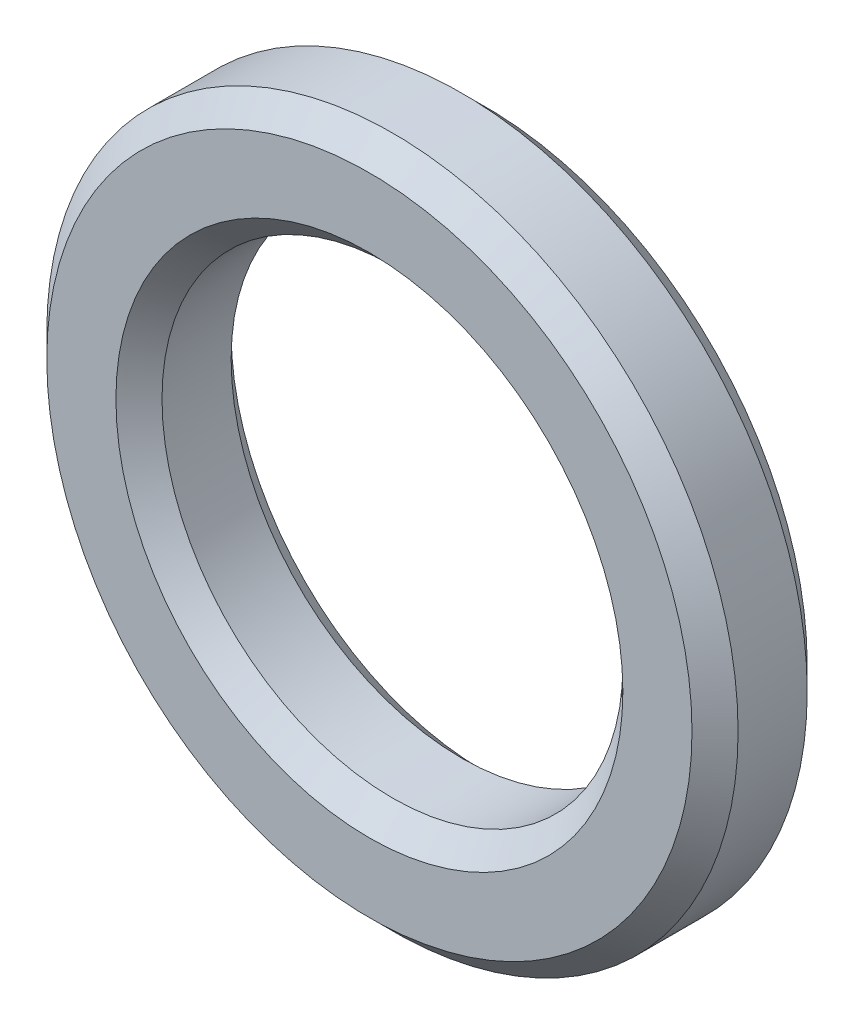
ISO-10303-21;
HEADER;
FILE_DESCRIPTION(('STEP AP214'),'2;1');
FILE_NAME('part.step','',(''),(''),'','','');
FILE_SCHEMA(('AUTOMOTIVE_DESIGN { 1 0 10303 214 1 1 1 1 }'));
ENDSEC;
DATA;
#1=APPLICATION_CONTEXT('core data for automotive mechanical design processes');
#2=APPLICATION_PROTOCOL_DEFINITION('international standard','automotive_design',2000,#1);
#3=PRODUCT_CONTEXT('',#1,'mechanical');
#4=PRODUCT('Part','Part','',(#3));
#5=PRODUCT_RELATED_PRODUCT_CATEGORY('part','',(#4));
#6=PRODUCT_DEFINITION_FORMATION('','',#4);
#7=PRODUCT_DEFINITION_CONTEXT('part definition',#1,'design');
#8=PRODUCT_DEFINITION('design','',#6,#7);
#9=PRODUCT_DEFINITION_SHAPE('','',#8);
#10=(LENGTH_UNIT() NAMED_UNIT(*) SI_UNIT(.MILLI.,.METRE.));
#11=(NAMED_UNIT(*) PLANE_ANGLE_UNIT() SI_UNIT($,.RADIAN.));
#12=(NAMED_UNIT(*) SI_UNIT($,.STERADIAN.) SOLID_ANGLE_UNIT());
#13=UNCERTAINTY_MEASURE_WITH_UNIT(LENGTH_MEASURE(1.E-05),#10,'distance_accuracy_value','');
#14=(GEOMETRIC_REPRESENTATION_CONTEXT(3) GLOBAL_UNCERTAINTY_ASSIGNED_CONTEXT((#13)) GLOBAL_UNIT_ASSIGNED_CONTEXT((#10,
#11,#12)) REPRESENTATION_CONTEXT('',''));
#15=CARTESIAN_POINT('',(0.,0.,0.));
#16=DIRECTION('',(0.,0.,1.));
#17=DIRECTION('',(1.,0.,0.));
#18=AXIS2_PLACEMENT_3D('',#15,#16,#17);
#19=CARTESIAN_POINT('',(0.,0.,5.));
#20=DIRECTION('',(0.,0.,1.));
#21=DIRECTION('',(1.,0.,0.));
#22=AXIS2_PLACEMENT_3D('',#19,#20,#21);
#23=PLANE('',#22);
#24=CARTESIAN_POINT('',(0.,0.,5.));
#25=DIRECTION('',(0.,0.,1.));
#26=DIRECTION('',(1.,0.,0.));
#27=AXIS2_PLACEMENT_3D('',#24,#25,#26);
#28=CIRCLE('',#27,14.);
#29=CARTESIAN_POINT('',(14.,0.,5.));
#30=VERTEX_POINT('',#29);
#31=EDGE_CURVE('E11',#30,#30,#28,.T.);
#32=ORIENTED_EDGE('',*,*,#31,.T.);
#33=EDGE_LOOP('',(#32));
#34=FACE_BOUND('',#33,.T.);
#35=CARTESIAN_POINT('',(0.,0.,5.));
#36=DIRECTION('',(0.,0.,1.));
#37=DIRECTION('',(1.,0.,0.));
#38=AXIS2_PLACEMENT_3D('',#35,#36,#37);
#39=CIRCLE('',#38,11.);
#40=CARTESIAN_POINT('',(11.,0.,5.));
#41=VERTEX_POINT('',#40);
#42=EDGE_CURVE('E54',#41,#41,#39,.F.);
#43=ORIENTED_EDGE('',*,*,#42,.T.);
#44=EDGE_LOOP('',(#43));
#45=FACE_BOUND('',#44,.T.);
#46=ADVANCED_FACE('F45',(#34,#45),#23,.T.);
#47=CARTESIAN_POINT('',(0.,0.,0.));
#48=DIRECTION('',(0.,0.,1.));
#49=DIRECTION('',(1.,0.,0.));
#50=AXIS2_PLACEMENT_3D('',#47,#48,#49);
#51=PLANE('',#50);
#52=CARTESIAN_POINT('',(0.,0.,0.));
#53=DIRECTION('',(0.,0.,1.));
#54=DIRECTION('',(1.,0.,0.));
#55=AXIS2_PLACEMENT_3D('',#52,#53,#54);
#56=CIRCLE('',#55,11.);
#57=CARTESIAN_POINT('',(11.,0.,0.));
#58=VERTEX_POINT('',#57);
#59=EDGE_CURVE('E78',#58,#58,#56,.T.);
#60=ORIENTED_EDGE('',*,*,#59,.T.);
#61=EDGE_LOOP('',(#60));
#62=FACE_BOUND('',#61,.T.);
#63=CARTESIAN_POINT('',(0.,0.,0.));
#64=DIRECTION('',(0.,0.,1.));
#65=DIRECTION('',(1.,0.,0.));
#66=AXIS2_PLACEMENT_3D('',#63,#64,#65);
#67=CIRCLE('',#66,14.);
#68=CARTESIAN_POINT('',(14.,0.,0.));
#69=VERTEX_POINT('',#68);
#70=EDGE_CURVE('E82',#69,#69,#67,.F.);
#71=ORIENTED_EDGE('',*,*,#70,.T.);
#72=EDGE_LOOP('',(#71));
#73=FACE_BOUND('',#72,.T.);
#74=ADVANCED_FACE('F87',(#62,#73),#51,.F.);
#75=CARTESIAN_POINT('',(0.,0.,5.));
#76=DIRECTION('',(0.,0.,-1.));
#77=DIRECTION('',(-1.,0.,0.));
#78=AXIS2_PLACEMENT_3D('',#75,#76,#77);
#79=CYLINDRICAL_SURFACE('',#78,15.);
#80=CARTESIAN_POINT('',(0.,0.,0.999999999999996));
#81=DIRECTION('',(0.,0.,1.));
#82=DIRECTION('',(1.,0.,0.));
#83=AXIS2_PLACEMENT_3D('',#80,#81,#82);
#84=CIRCLE('',#83,15.);
#85=CARTESIAN_POINT('',(15.,0.,0.999999999999996));
#86=VERTEX_POINT('',#85);
#87=EDGE_CURVE('E59',#86,#86,#84,.T.);
#88=ORIENTED_EDGE('',*,*,#87,.T.);
#89=EDGE_LOOP('',(#88));
#90=FACE_BOUND('',#89,.T.);
#91=CARTESIAN_POINT('',(0.,0.,4.));
#92=DIRECTION('',(0.,0.,1.));
#93=DIRECTION('',(1.,0.,0.));
#94=AXIS2_PLACEMENT_3D('',#91,#92,#93);
#95=CIRCLE('',#94,15.);
#96=CARTESIAN_POINT('',(15.,0.,4.));
#97=VERTEX_POINT('',#96);
#98=EDGE_CURVE('E64',#97,#97,#95,.F.);
#99=ORIENTED_EDGE('',*,*,#98,.T.);
#100=EDGE_LOOP('',(#99));
#101=FACE_BOUND('',#100,.T.);
#102=ADVANCED_FACE('F97',(#90,#101),#79,.T.);
#103=CARTESIAN_POINT('',(0.,0.,5.));
#104=DIRECTION('',(0.,0.,-1.));
#105=DIRECTION('',(-1.,0.,0.));
#106=AXIS2_PLACEMENT_3D('',#103,#104,#105);
#107=CYLINDRICAL_SURFACE('',#106,10.);
#108=CARTESIAN_POINT('',(0.,0.,1.));
#109=DIRECTION('',(0.,0.,1.));
#110=DIRECTION('',(1.,0.,0.));
#111=AXIS2_PLACEMENT_3D('',#108,#109,#110);
#112=CIRCLE('',#111,10.);
#113=CARTESIAN_POINT('',(10.,0.,1.));
#114=VERTEX_POINT('',#113);
#115=EDGE_CURVE('E70',#114,#114,#112,.F.);
#116=ORIENTED_EDGE('',*,*,#115,.T.);
#117=EDGE_LOOP('',(#116));
#118=FACE_BOUND('',#117,.T.);
#119=CARTESIAN_POINT('',(0.,0.,4.));
#120=DIRECTION('',(0.,0.,1.));
#121=DIRECTION('',(1.,0.,0.));
#122=AXIS2_PLACEMENT_3D('',#119,#120,#121);
#123=CIRCLE('',#122,10.);
#124=CARTESIAN_POINT('',(10.,0.,4.));
#125=VERTEX_POINT('',#124);
#126=EDGE_CURVE('E74',#125,#125,#123,.T.);
#127=ORIENTED_EDGE('',*,*,#126,.T.);
#128=EDGE_LOOP('',(#127));
#129=FACE_BOUND('',#128,.T.);
#130=ADVANCED_FACE('F100',(#118,#129),#107,.F.);
#131=CARTESIAN_POINT('',(0.,0.,0.));
#132=DIRECTION('',(0.,0.,-1.));
#133=DIRECTION('',(-1.,0.,0.));
#134=AXIS2_PLACEMENT_3D('',#131,#132,#133);
#135=CONICAL_SURFACE('',#134,11.,0.785398163397447);
#136=ORIENTED_EDGE('',*,*,#115,.F.);
#137=EDGE_LOOP('',(#136));
#138=FACE_BOUND('',#137,.T.);
#139=ORIENTED_EDGE('',*,*,#59,.F.);
#140=EDGE_LOOP('',(#139));
#141=FACE_BOUND('',#140,.T.);
#142=ADVANCED_FACE('F93',(#138,#141),#135,.F.);
#143=CARTESIAN_POINT('',(0.,0.,0.999999999999996));
#144=DIRECTION('',(0.,0.,1.));
#145=DIRECTION('',(1.,0.,0.));
#146=AXIS2_PLACEMENT_3D('',#143,#144,#145);
#147=CONICAL_SURFACE('',#146,15.,0.78539816339745);
#148=ORIENTED_EDGE('',*,*,#70,.F.);
#149=EDGE_LOOP('',(#148));
#150=FACE_BOUND('',#149,.T.);
#151=ORIENTED_EDGE('',*,*,#87,.F.);
#152=EDGE_LOOP('',(#151));
#153=FACE_BOUND('',#152,.T.);
#154=ADVANCED_FACE('F89',(#150,#153),#147,.T.);
#155=CARTESIAN_POINT('',(0.,0.,5.));
#156=DIRECTION('',(0.,0.,-1.));
#157=DIRECTION('',(-1.,0.,0.));
#158=AXIS2_PLACEMENT_3D('',#155,#156,#157);
#159=CONICAL_SURFACE('',#158,14.,0.785398163397446);
#160=ORIENTED_EDGE('',*,*,#98,.F.);
#161=EDGE_LOOP('',(#160));
#162=FACE_BOUND('',#161,.T.);
#163=ORIENTED_EDGE('',*,*,#31,.F.);
#164=EDGE_LOOP('',(#163));
#165=FACE_BOUND('',#164,.T.);
#166=ADVANCED_FACE('F92',(#162,#165),#159,.T.);
#167=CARTESIAN_POINT('',(0.,0.,4.));
#168=DIRECTION('',(0.,0.,1.));
#169=DIRECTION('',(1.,0.,0.));
#170=AXIS2_PLACEMENT_3D('',#167,#168,#169);
#171=CONICAL_SURFACE('',#170,10.,0.785398163397448);
#172=ORIENTED_EDGE('',*,*,#42,.F.);
#173=EDGE_LOOP('',(#172));
#174=FACE_BOUND('',#173,.T.);
#175=ORIENTED_EDGE('',*,*,#126,.F.);
#176=EDGE_LOOP('',(#175));
#177=FACE_BOUND('',#176,.T.);
#178=ADVANCED_FACE('F48',(#174,#177),#171,.F.);
#179=CLOSED_SHELL('',(#46,#74,#102,#130,#142,#154,#166,#178));
#180=MANIFOLD_SOLID_BREP('B2',#179);
#181=ADVANCED_BREP_SHAPE_REPRESENTATION('',(#18,#180),#14);
#182=SHAPE_DEFINITION_REPRESENTATION(#9,#181);
ENDSEC;
END-ISO-10303-21;
